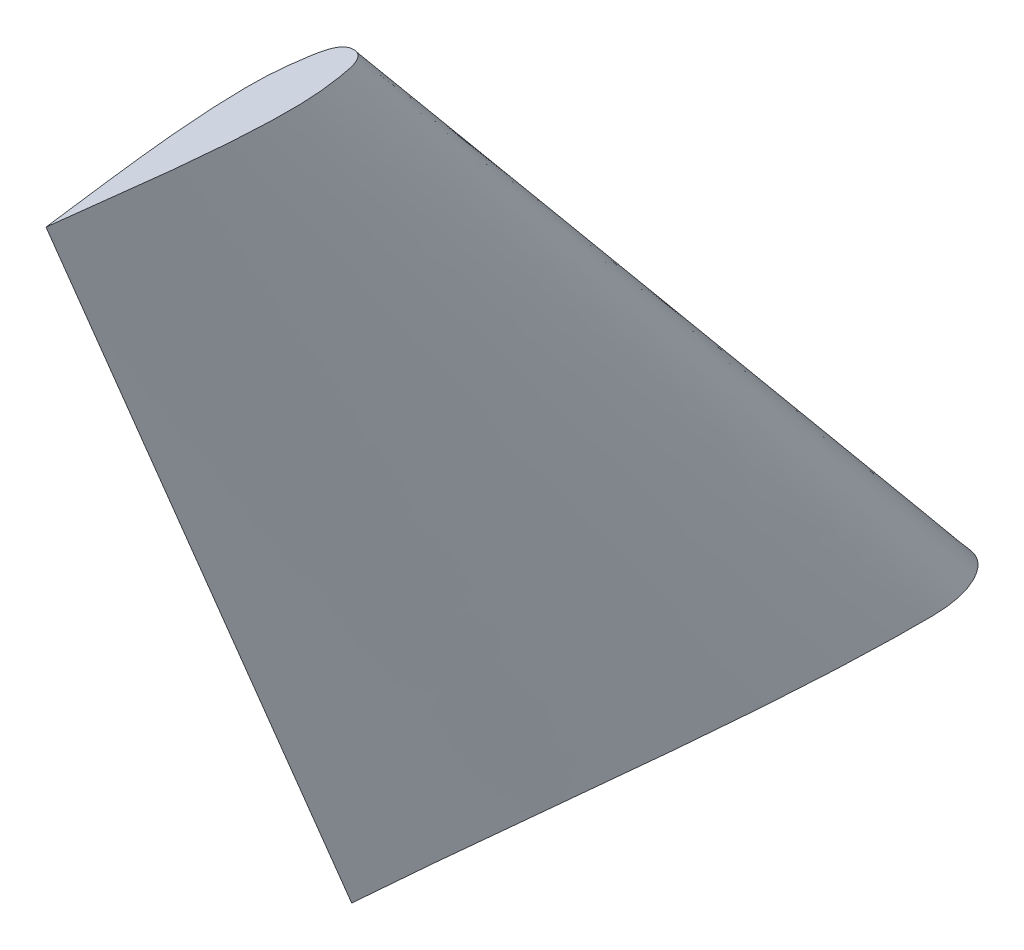
ISO-10303-21;
HEADER;
FILE_DESCRIPTION(('STEP AP214'),'2;1');
FILE_NAME('part.step','',(''),(''),'','','');
FILE_SCHEMA(('AUTOMOTIVE_DESIGN { 1 0 10303 214 1 1 1 1 }'));
ENDSEC;
DATA;
#1=APPLICATION_CONTEXT('core data for automotive mechanical design processes');
#2=APPLICATION_PROTOCOL_DEFINITION('international standard','automotive_design',2000,#1);
#3=PRODUCT_CONTEXT('',#1,'mechanical');
#4=PRODUCT('Part','Part','',(#3));
#5=PRODUCT_RELATED_PRODUCT_CATEGORY('part','',(#4));
#6=PRODUCT_DEFINITION_FORMATION('','',#4);
#7=PRODUCT_DEFINITION_CONTEXT('part definition',#1,'design');
#8=PRODUCT_DEFINITION('design','',#6,#7);
#9=PRODUCT_DEFINITION_SHAPE('','',#8);
#10=(LENGTH_UNIT() NAMED_UNIT(*) SI_UNIT(.MILLI.,.METRE.));
#11=(NAMED_UNIT(*) PLANE_ANGLE_UNIT() SI_UNIT($,.RADIAN.));
#12=(NAMED_UNIT(*) SI_UNIT($,.STERADIAN.) SOLID_ANGLE_UNIT());
#13=UNCERTAINTY_MEASURE_WITH_UNIT(LENGTH_MEASURE(1.E-05),#10,'distance_accuracy_value','');
#14=(GEOMETRIC_REPRESENTATION_CONTEXT(3) GLOBAL_UNCERTAINTY_ASSIGNED_CONTEXT((#13)) GLOBAL_UNIT_ASSIGNED_CONTEXT((#10,
#11,#12)) REPRESENTATION_CONTEXT('',''));
#15=CARTESIAN_POINT('',(0.,0.,0.));
#16=DIRECTION('',(0.,0.,1.));
#17=DIRECTION('',(1.,0.,0.));
#18=AXIS2_PLACEMENT_3D('',#15,#16,#17);
#19=CARTESIAN_POINT('',(186.355683918216,7657.2618,7922.07926030752));
#20=DIRECTION('',(0.,1.,0.));
#21=DIRECTION('',(0.,0.,1.));
#22=AXIS2_PLACEMENT_3D('',#19,#20,#21);
#23=PLANE('',#22);
#24=CARTESIAN_POINT('',(8.21499502243191E-13,7657.2618,9551.47559577085));
#25=CARTESIAN_POINT('',(85.8536731267102,7657.2618,8845.10345360032));
#26=CARTESIAN_POINT('',(250.417111798389,7657.2618,7729.63399537587));
#27=CARTESIAN_POINT('',(203.557677715276,7657.2618,6792.00969236417));
#28=CARTESIAN_POINT('',(114.976251497957,7657.2618,6360.95619577086));
#29=CARTESIAN_POINT('',(4.64905891561784E-13,7657.2618,6360.95619577086));
#30=B_SPLINE_CURVE_WITH_KNOTS('',3,(#24,#25,#26,#27,#28,#29),.UNSPECIFIED.,.F.,.F.,(4,1,1,4),
(0.,0.714088704934822,0.896349483933911,1.),.UNSPECIFIED.);
#31=CARTESIAN_POINT('',(8.66380139375366E-13,7657.2618,9551.47559577085));
#32=VERTEX_POINT('',#31);
#33=CARTESIAN_POINT('',(-3.58841129944124E-05,7657.2618,6360.95619577086));
#34=VERTEX_POINT('',#33);
#35=EDGE_CURVE('E102',#32,#34,#30,.T.);
#36=ORIENTED_EDGE('',*,*,#35,.T.);
#37=CARTESIAN_POINT('',(4.64905891561784E-13,7657.2618,6360.95619577086));
#38=CARTESIAN_POINT('',(-114.976251497956,7657.2618,6360.95619577086));
#39=CARTESIAN_POINT('',(-203.557677715276,7657.2618,6792.00969236417));
#40=CARTESIAN_POINT('',(-250.417111798388,7657.2618,7729.63399537587));
#41=CARTESIAN_POINT('',(-85.8536731267114,7657.2618,8845.10345360032));
#42=CARTESIAN_POINT('',(8.66380139375366E-13,7657.2618,9551.47559577085));
#43=B_SPLINE_CURVE_WITH_KNOTS('',3,(#37,#38,#39,#40,#41,#42),.UNSPECIFIED.,.F.,.F.,(4,1,1,4),
(0.,0.103650516066089,0.285911295065178,1.),.UNSPECIFIED.);
#44=EDGE_CURVE('E13',#34,#32,#43,.T.);
#45=ORIENTED_EDGE('',*,*,#44,.T.);
#46=EDGE_LOOP('',(#36,#45));
#47=FACE_BOUND('',#46,.T.);
#48=ADVANCED_FACE('F92',(#47),#23,.T.);
#49=CARTESIAN_POINT('',(317.422584093436,0.,3106.09999562608));
#50=DIRECTION('',(0.,1.,0.));
#51=DIRECTION('',(0.,0.,1.));
#52=AXIS2_PLACEMENT_3D('',#49,#50,#51);
#53=PLANE('',#52);
#54=CARTESIAN_POINT('',(7.62110748672077E-13,0.,6381.0388));
#55=CARTESIAN_POINT('',(135.516632530771,0.,4591.26948341147));
#56=CARTESIAN_POINT('',(459.330315844269,0.,2503.69122279822));
#57=CARTESIAN_POINT('',(429.111316456623,0.,403.655670705673));
#58=CARTESIAN_POINT('',(203.389315301826,0.,0.));
#59=CARTESIAN_POINT('',(0.,0.,0.));
#60=B_SPLINE_CURVE_WITH_KNOTS('',3,(#54,#55,#56,#57,#58,#59),.UNSPECIFIED.,.F.,.F.,(4,1,1,4),
(0.,0.841181970262739,0.912840830479199,1.),.UNSPECIFIED.);
#61=CARTESIAN_POINT('',(7.85501595113804E-13,0.,6381.0388));
#62=VERTEX_POINT('',#61);
#63=CARTESIAN_POINT('',(-0.000214897624335221,0.,0.));
#64=VERTEX_POINT('',#63);
#65=EDGE_CURVE('E127',#62,#64,#60,.T.);
#66=ORIENTED_EDGE('',*,*,#65,.F.);
#67=CARTESIAN_POINT('',(0.,0.,0.));
#68=CARTESIAN_POINT('',(-203.389315301826,0.,0.));
#69=CARTESIAN_POINT('',(-429.111316456623,0.,403.655670705672));
#70=CARTESIAN_POINT('',(-459.330315844269,0.,2503.69122279822));
#71=CARTESIAN_POINT('',(-135.516632530771,0.,4591.26948341147));
#72=CARTESIAN_POINT('',(7.85501595113804E-13,0.,6381.0388));
#73=B_SPLINE_CURVE_WITH_KNOTS('',3,(#67,#68,#69,#70,#71,#72),.UNSPECIFIED.,.F.,.F.,(4,1,1,4),
(0.,0.0871591695208015,0.158818029737261,1.),.UNSPECIFIED.);
#74=EDGE_CURVE('E124',#64,#62,#73,.T.);
#75=ORIENTED_EDGE('',*,*,#74,.F.);
#76=EDGE_LOOP('',(#66,#75));
#77=FACE_BOUND('',#76,.T.);
#78=ADVANCED_FACE('F126',(#77),#53,.F.);
#79=CARTESIAN_POINT('',(-0.000214897624335221,0.,0.));
#80=CARTESIAN_POINT('',(-0.000155226453887707,2552.4206,2120.31873192362));
#81=CARTESIAN_POINT('',(-9.55552834401921E-05,5104.8412,4240.63746384724));
#82=CARTESIAN_POINT('',(-3.58841129944124E-05,7657.2618,6360.95619577086));
#83=CARTESIAN_POINT('',(-8.58641909058416,0.,0.));
#84=CARTESIAN_POINT('',(-7.14742816589363,2552.4206,2120.31873192362));
#85=CARTESIAN_POINT('',(-5.70843724120311,5104.8412,4240.63746384724));
#86=CARTESIAN_POINT('',(-4.26944631651258,7657.2618,6360.95619577086));
#87=CARTESIAN_POINT('',(-25.759896161834,0.,0.791391700747513));
#88=CARTESIAN_POINT('',(-21.4431122576395,2552.4206,2120.99021937591));
#89=CARTESIAN_POINT('',(-17.1263283534451,5104.84120000001,4241.18904705106));
#90=CARTESIAN_POINT('',(-12.8095444492506,7657.26180000001,6361.38787472622));
#91=CARTESIAN_POINT('',(-51.2903069620717,0.,4.44356282761769));
#92=CARTESIAN_POINT('',(-42.6836120542045,2552.42059999999,2124.1186358765));
#93=CARTESIAN_POINT('',(-34.0769171463372,5104.84119999999,4243.79370892537));
#94=CARTESIAN_POINT('',(-25.47022223847,7657.26179999998,6363.46878197425));
#95=CARTESIAN_POINT('',(-76.3419763492192,0.,10.5664579766032));
#96=CARTESIAN_POINT('',(-63.49116447895,2552.42060000001,2129.39851794402));
#97=CARTESIAN_POINT('',(-50.6403526086807,5104.84120000002,4248.23057791143));
#98=CARTESIAN_POINT('',(-37.7895407384114,7657.26180000002,6367.06263787885));
#99=CARTESIAN_POINT('',(-100.686966910344,0.,19.0781807852257));
#100=CARTESIAN_POINT('',(-83.6469629783597,2552.42059999999,2136.77237279649));
#101=CARTESIAN_POINT('',(-66.6069590463759,5104.84119999999,4254.46656480776));
#102=CARTESIAN_POINT('',(-49.566955114392,7657.26179999998,6372.16075681902));
#103=CARTESIAN_POINT('',(-124.126516485176,0.,29.818862451615));
#104=CARTESIAN_POINT('',(-102.961622782143,2552.42060000001,2146.09814126592));
#105=CARTESIAN_POINT('',(-81.796729079111,5104.84120000001,4262.37742008022));
#106=CARTESIAN_POINT('',(-60.6318353760786,7657.26180000002,6378.65669889453));
#107=CARTESIAN_POINT('',(-146.534589998104,0.,42.5794578087664));
#108=CARTESIAN_POINT('',(-121.315486684902,2552.4206,2157.17861408429));
#109=CARTESIAN_POINT('',(-96.0963833716992,5104.8412,4271.77777035981));
#110=CARTESIAN_POINT('',(-70.8772800584966,7657.26179999999,6386.37692663533));
#111=CARTESIAN_POINT('',(-167.813486414974,0.,57.1220922538986));
#112=CARTESIAN_POINT('',(-138.630325895816,2552.4206,2169.78518123356));
#113=CARTESIAN_POINT('',(-109.447165376658,5104.8412,4282.44827021323));
#114=CARTESIAN_POINT('',(-80.2640048575004,7657.2618,6395.1113591929));
#115=CARTESIAN_POINT('',(-194.665676287825,0.,78.5829167872505));
#116=CARTESIAN_POINT('',(-160.331308129858,2552.4206,2188.34010838197));
#117=CARTESIAN_POINT('',(-125.996939971891,5104.84119999999,4298.09729997669));
#118=CARTESIAN_POINT('',(-91.6625718139239,7657.26179999999,6407.85449157141));
#119=CARTESIAN_POINT('',(-225.355086307879,0.,108.718769508397));
#120=CARTESIAN_POINT('',(-184.884042323736,2552.4206,2214.27167623462));
#121=CARTESIAN_POINT('',(-144.412998339592,5104.8412,4319.82458296084));
#122=CARTESIAN_POINT('',(-103.941954355449,7657.26180000001,6425.37748968706));
#123=CARTESIAN_POINT('',(-257.930018105795,0.,148.714825694696));
#124=CARTESIAN_POINT('',(-210.658258304091,2552.4206,2248.46051952688));
#125=CARTESIAN_POINT('',(-163.386498502387,5104.8412,4348.20621335907));
#126=CARTESIAN_POINT('',(-116.114738700683,7657.2618,6447.95190719126));
#127=CARTESIAN_POINT('',(-286.712692746919,0.,191.496131022113));
#128=CARTESIAN_POINT('',(-233.235761425267,2552.4206,2284.82558335717));
#129=CARTESIAN_POINT('',(-179.758830103614,5104.84119999999,4378.15503569223));
#130=CARTESIAN_POINT('',(-126.281898781962,7657.26179999999,6471.48448802729));
#131=CARTESIAN_POINT('',(-312.150800154988,0.,236.332366305832));
#132=CARTESIAN_POINT('',(-253.061163747773,2552.4206,2322.76330190216));
#133=CARTESIAN_POINT('',(-193.971527340559,5104.84120000001,4409.19423749849));
#134=CARTESIAN_POINT('',(-134.881890933344,7657.26180000001,6495.62517309482));
#135=CARTESIAN_POINT('',(-334.618677488732,0.,282.719322591736));
#136=CARTESIAN_POINT('',(-270.497150587094,2552.4206,2361.86783800602));
#137=CARTESIAN_POINT('',(-206.375623685457,5104.8412,4441.01635342031));
#138=CARTESIAN_POINT('',(-142.254096783819,7657.2618,6520.1648688346));
#139=CARTESIAN_POINT('',(-354.413895962148,0.,330.302917473413));
#140=CARTESIAN_POINT('',(-285.828877106481,2552.4206,2401.85921378709));
#141=CARTESIAN_POINT('',(-217.243858250814,5104.8412,4473.41551010076));
#142=CARTESIAN_POINT('',(-148.658839395146,7657.26180000001,6544.97180641443));
#143=CARTESIAN_POINT('',(-371.749124744476,0.,378.833386918108));
#144=CARTESIAN_POINT('',(-299.267459003855,2552.4206,2442.54266806825));
#145=CARTESIAN_POINT('',(-226.785793263235,5104.8412,4506.25194921838));
#146=CARTESIAN_POINT('',(-154.304127522615,7657.2618,6569.96123036852));
#147=CARTESIAN_POINT('',(-386.767369839134,0.,428.128526178291));
#148=CARTESIAN_POINT('',(-310.964194696892,2552.4206,2483.77763219685));
#149=CARTESIAN_POINT('',(-235.16101955465,5104.8412,4539.4267382154));
#150=CARTESIAN_POINT('',(-159.357844412408,7657.2618,6595.07584423396));
#151=CARTESIAN_POINT('',(-399.508807364748,0.,478.060200145017));
#152=CARTESIAN_POINT('',(-320.995759786967,2552.4206,2525.46508296834));
#153=CARTESIAN_POINT('',(-242.482712209185,5104.8412,4572.86996579167));
#154=CARTESIAN_POINT('',(-163.969664631404,7657.2618,6620.27484861499));
#155=CARTESIAN_POINT('',(-409.974965801421,0.,528.517290082204));
#156=CARTESIAN_POINT('',(-329.405138872338,2552.4206,2567.52123470583));
#157=CARTESIAN_POINT('',(-248.835311943255,5104.84119999999,4606.52517932946));
#158=CARTESIAN_POINT('',(-168.265485014173,7657.26179999999,6645.52912395309));
#159=CARTESIAN_POINT('',(-418.24759258402,0.,579.378417392363));
#160=CARTESIAN_POINT('',(-336.296292301743,2552.4206,2609.8560155022));
#161=CARTESIAN_POINT('',(-254.344992019465,5104.8412,4640.33361361203));
#162=CARTESIAN_POINT('',(-172.393691737188,7657.2618,6670.81121172186));
#163=CARTESIAN_POINT('',(-424.469464572837,0.,630.529095209966));
#164=CARTESIAN_POINT('',(-341.772327699914,2552.4206,2652.39152058623));
#165=CARTESIAN_POINT('',(-259.075190826991,5104.8412,4674.2539459625));
#166=CARTESIAN_POINT('',(-176.378053954067,7657.2618,6696.11637133877));
#167=CARTESIAN_POINT('',(-428.852102196026,0.,681.867721943306));
#168=CARTESIAN_POINT('',(-345.969538514267,2552.4206,2695.06046655977));
#169=CARTESIAN_POINT('',(-263.086974832508,5104.8412,4708.25321117624));
#170=CARTESIAN_POINT('',(-180.204411150749,7657.2618,6721.4459557927));
#171=CARTESIAN_POINT('',(-431.662147493104,0.,733.314165742358));
#172=CARTESIAN_POINT('',(-349.063652064271,2552.4206,2737.80936979569));
#173=CARTESIAN_POINT('',(-266.465156635437,5104.84119999999,4742.30457384902));
#174=CARTESIAN_POINT('',(-183.866661206604,7657.26179999999,6746.79977790234));
#175=CARTESIAN_POINT('',(-433.212846627461,0.,784.811852287034));
#176=CARTESIAN_POINT('',(-351.261465085308,2552.4206,2780.60045168682));
#177=CARTESIAN_POINT('',(-269.310083543154,5104.8412,4776.3890510866));
#178=CARTESIAN_POINT('',(-187.358702001001,7657.2618,6772.17765048638));
#179=CARTESIAN_POINT('',(-433.850156479728,0.,836.327364779922));
#180=CARTESIAN_POINT('',(-352.791284234513,2552.4206,2823.41132891647));
#181=CARTESIAN_POINT('',(-271.732411989299,5104.84120000001,4810.49529305302));
#182=CARTESIAN_POINT('',(-190.673539744084,7657.26180000001,6797.57925718956));
#183=CARTESIAN_POINT('',(-433.939042056308,0.,887.845696459307));
#184=CARTESIAN_POINT('',(-353.89408825287,2552.4206,2866.23189152508));
#185=CARTESIAN_POINT('',(-273.849134449433,5104.8412,4844.61808659086));
#186=CARTESIAN_POINT('',(-193.804180645996,7657.2618,6823.00428165664));
#187=CARTESIAN_POINT('',(-433.857539948716,0.,939.363797322214));
#188=CARTESIAN_POINT('',(-354.81996680699,2552.4206,2909.05985411013));
#189=CARTESIAN_POINT('',(-275.782393665263,5104.84119999999,4878.75591089805));
#190=CARTESIAN_POINT('',(-196.744820523537,7657.26179999999,6848.45196768597));
#191=CARTESIAN_POINT('',(-433.613648288481,0.,990.881448362189));
#192=CARTESIAN_POINT('',(-355.572317256822,2552.4206,2951.8948186001));
#193=CARTESIAN_POINT('',(-277.530986225163,5104.8412,4912.90818883802));
#194=CARTESIAN_POINT('',(-199.489655193504,7657.2618,6873.92155907593));
#195=CARTESIAN_POINT('',(-433.208729007278,0.,1042.39803545094));
#196=CARTESIAN_POINT('',(-356.150523328982,2552.4206,2994.73600232577));
#197=CARTESIAN_POINT('',(-279.092317650687,5104.8412,4947.0739692006));
#198=CARTESIAN_POINT('',(-202.034111972391,7657.26180000001,6899.41193607543));
#199=CARTESIAN_POINT('',(-432.646857062219,0.,1093.91315173615));
#200=CARTESIAN_POINT('',(-356.555777433709,2552.4206,3037.58276080189));
#201=CARTESIAN_POINT('',(-280.464697805199,5104.8412,4981.25236986763));
#202=CARTESIAN_POINT('',(-204.373618176689,7657.2618,6924.92197893337));
#203=CARTESIAN_POINT('',(-431.930695070181,0.,1145.42633110234));
#204=CARTESIAN_POINT('',(-356.789075201128,2552.4206,3080.43428075297));
#205=CARTESIAN_POINT('',(-281.647455332076,5104.8412,5015.44223040361));
#206=CARTESIAN_POINT('',(-206.505835463024,7657.2618,6950.45018005425));
#207=CARTESIAN_POINT('',(-431.06358963652,0.,1196.93718073217));
#208=CARTESIAN_POINT('',(-356.851868253687,2552.4206,3123.28979776896));
#209=CARTESIAN_POINT('',(-282.640146870855,5104.8412,5049.64241480575));
#210=CARTESIAN_POINT('',(-208.428425488022,7657.2618,6975.99503184254));
#211=CARTESIAN_POINT('',(-430.048462035651,0.,1248.44531022851));
#212=CARTESIAN_POINT('',(-356.746314540537,2552.4206,3166.148461263));
#213=CARTESIAN_POINT('',(-283.444167045423,5104.8412,5083.8516122975));
#214=CARTESIAN_POINT('',(-210.142019550308,7657.2618,7001.55476333199));
#215=CARTESIAN_POINT('',(-428.888403670412,0.,1299.9503665468));
#216=CARTESIAN_POINT('',(-356.474685429776,2552.4206,3209.00944554999));
#217=CARTESIAN_POINT('',(-284.060967189141,5104.8412,5118.06852455317));
#218=CARTESIAN_POINT('',(-211.647248948505,7657.2618,7027.12760355636));
#219=CARTESIAN_POINT('',(-427.586355140652,0.,1351.45201642407));
#220=CARTESIAN_POINT('',(-356.040273320712,2552.4206,3251.8719024175));
#221=CARTESIAN_POINT('',(-284.494191500771,5104.84120000001,5152.29178841094));
#222=CARTESIAN_POINT('',(-212.948109680831,7657.26180000001,7052.71167440437));
#223=CARTESIAN_POINT('',(-426.145285348602,0.,1402.94994956525));
#224=CARTESIAN_POINT('',(-355.446389480902,2552.4206,3294.73499896509));
#225=CARTESIAN_POINT('',(-284.747493613203,5104.84120000001,5186.52004836493));
#226=CARTESIAN_POINT('',(-214.048597745503,7657.26180000001,7078.30509776477));
#227=CARTESIAN_POINT('',(-424.042352582233,0.,1471.60852901836));
#228=CARTESIAN_POINT('',(-354.448060381216,2552.4206,3351.88561089343));
#229=CARTESIAN_POINT('',(-284.8537681802,5104.84120000001,5232.16269276851));
#230=CARTESIAN_POINT('',(-215.259475979183,7657.26180000001,7112.43977464358));
#231=CARTESIAN_POINT('',(-421.080586730666,0.,1557.42107798737));
#232=CARTESIAN_POINT('',(-352.824510651564,2552.42059999999,3423.32160564312));
#233=CARTESIAN_POINT('',(-284.568434572462,5104.84119999999,5289.22213329887));
#234=CARTESIAN_POINT('',(-216.31235849336,7657.26179999998,7155.12266095462));
#235=CARTESIAN_POINT('',(-417.016092181368,0.,1660.37718848034));
#236=CARTESIAN_POINT('',(-350.319262328439,2552.4206,3509.03602487807));
#237=CARTESIAN_POINT('',(-283.62243247551,5104.84120000001,5357.69486127581));
#238=CARTESIAN_POINT('',(-216.925602622581,7657.26180000001,7206.35369767354));
#239=CARTESIAN_POINT('',(-412.463278073508,0.,1763.31280061194));
#240=CARTESIAN_POINT('',(-347.311286333832,2552.4206,3594.73788535115));
#241=CARTESIAN_POINT('',(-282.159294594156,5104.8412,5426.16297009037));
#242=CARTESIAN_POINT('',(-217.007302854479,7657.26179999999,7257.58805482959));
#243=CARTESIAN_POINT('',(-407.443701262236,0.,1866.22665039092));
#244=CARTESIAN_POINT('',(-343.84814297821,2552.4206,3680.424819645));
#245=CARTESIAN_POINT('',(-280.252584694185,5104.8412,5494.62298889908));
#246=CARTESIAN_POINT('',(-216.657026410159,7657.2618,7308.82115815317));
#247=CARTESIAN_POINT('',(-401.978441420699,0.,1969.11774190754));
#248=CARTESIAN_POINT('',(-339.948990598054,2552.4206,3766.09507699395));
#249=CARTESIAN_POINT('',(-277.919539775409,5104.84119999999,5563.07241208036));
#250=CARTESIAN_POINT('',(-215.890088952764,7657.26179999999,7360.04974716676));
#251=CARTESIAN_POINT('',(-396.088123577593,0.,2071.98532652268));
#252=CARTESIAN_POINT('',(-335.638162131061,2552.4206,3851.74723184566));
#253=CARTESIAN_POINT('',(-275.188200684528,5104.84120000001,5631.50913716864));
#254=CARTESIAN_POINT('',(-214.738239237995,7657.26180000001,7411.27104249162));
#255=CARTESIAN_POINT('',(-389.79294505351,0.,2174.8288833886));
#256=CARTESIAN_POINT('',(-330.93592078071,2552.4206,3937.38020563405));
#257=CARTESIAN_POINT('',(-272.07889650791,5104.84119999999,5699.93152787951));
#258=CARTESIAN_POINT('',(-213.22187223511,7657.26179999999,7462.48285012496));
#259=CARTESIAN_POINT('',(-383.112689872653,0.,2277.64810683832));
#260=CARTESIAN_POINT('',(-325.863261728675,2552.4206,4022.99319652744));
#261=CARTESIAN_POINT('',(-268.613833584697,5104.8412,5768.33828621657));
#262=CARTESIAN_POINT('',(-211.36440544072,7657.2618,7513.68337590568));
#263=CARTESIAN_POINT('',(-376.066770171844,0.,2380.44287868014));
#264=CARTESIAN_POINT('',(-320.439517784438,2552.4206,4108.58565204653));
#265=CARTESIAN_POINT('',(-264.812265397032,5104.8412,5836.72842541293));
#266=CARTESIAN_POINT('',(-209.185013009626,7657.2618,7564.87119877933));
#267=CARTESIAN_POINT('',(-368.674208110804,0.,2483.21327637803));
#268=CARTESIAN_POINT('',(-314.683704596806,2552.4206,4194.15725380347));
#269=CARTESIAN_POINT('',(-260.693201082808,5104.8412,5905.10123122892));
#270=CARTESIAN_POINT('',(-206.70269756881,7657.2618,7616.04520865437));
#271=CARTESIAN_POINT('',(-360.953739717611,0.,2585.95951809336));
#272=CARTESIAN_POINT('',(-308.61402235307,2552.4206,4279.70785443917));
#273=CARTESIAN_POINT('',(-256.27430498853,5104.8412,5973.45619078497));
#274=CARTESIAN_POINT('',(-203.93458762399,7657.2618,7667.20452713078));
#275=CARTESIAN_POINT('',(-350.246997846213,0.,2722.92285862346));
#276=CARTESIAN_POINT('',(-300.126008962632,2552.4206,4393.74742350489));
#277=CARTESIAN_POINT('',(-250.005020079051,5104.8412,6064.57198838632));
#278=CARTESIAN_POINT('',(-199.88403119547,7657.2618,7735.39655326775));
#279=CARTESIAN_POINT('',(-336.13505631491,0.,2894.06890719331));
#280=CARTESIAN_POINT('',(-288.81823452679,2552.4206,4536.2449589447));
#281=CARTESIAN_POINT('',(-241.501412738669,5104.8412,6178.42101069608));
#282=CARTESIAN_POINT('',(-194.184590950548,7657.2618,7820.59706244746));
#283=CARTESIAN_POINT('',(-318.176566162172,0.,3099.35694168511));
#284=CARTESIAN_POINT('',(-274.263227398095,2552.4206,4707.16215898682));
#285=CARTESIAN_POINT('',(-230.349888634017,5104.8412,6314.96737628853));
#286=CARTESIAN_POINT('',(-186.43654986994,7657.2618,7922.77259359023));
#287=CARTESIAN_POINT('',(-299.331537617137,0.,3304.56534933049));
#288=CARTESIAN_POINT('',(-258.846508315067,2552.4206,4878.00460757822));
#289=CARTESIAN_POINT('',(-218.361479012996,5104.8412,6451.44386582596));
#290=CARTESIAN_POINT('',(-177.876449710926,7657.26180000001,8024.88312407369));
#291=CARTESIAN_POINT('',(-279.734520371428,0.,3509.70320378876));
#292=CARTESIAN_POINT('',(-242.686740349776,2552.4206,5048.77883801123));
#293=CARTESIAN_POINT('',(-205.638960328124,5104.8412,6587.8544722337));
#294=CARTESIAN_POINT('',(-168.591180306473,7657.26179999999,8126.93010645617));
#295=CARTESIAN_POINT('',(-259.517568752942,0.,3714.78083187621));
#296=CARTESIAN_POINT('',(-225.898224124428,2552.4206,5219.49257864675));
#297=CARTESIAN_POINT('',(-192.278879495915,5104.84120000001,6724.20432541728));
#298=CARTESIAN_POINT('',(-158.659534867402,7657.26180000001,8228.91607218782));
#299=CARTESIAN_POINT('',(-238.810901829392,0.,3919.80957326912));
#300=CARTESIAN_POINT('',(-208.591904980949,2552.42059999999,5390.15450918104));
#301=CARTESIAN_POINT('',(-178.372908132506,5104.84119999999,6860.49944509295));
#302=CARTESIAN_POINT('',(-148.153911284062,7657.26179999998,8330.84438100487));
#303=CARTESIAN_POINT('',(-217.743495697605,0.,4124.80158750387));
#304=CARTESIAN_POINT('',(-190.876193868182,2552.42060000001,5560.77408196353));
#305=CARTESIAN_POINT('',(-164.008892038758,5104.84120000001,6996.74657642318));
#306=CARTESIAN_POINT('',(-137.141590209334,7657.26180000002,8432.71907088284));
#307=CARTESIAN_POINT('',(-196.443741384427,0.,4329.76964948671));
#308=CARTESIAN_POINT('',(-172.857808839377,2552.42059999999,5731.36134746478));
#309=CARTESIAN_POINT('',(-149.271876294328,5104.84119999999,7132.95304544285));
#310=CARTESIAN_POINT('',(-125.685943749278,7657.26179999998,8534.54474342092));
#311=CARTESIAN_POINT('',(-175.039999692821,0.,4534.72699224611));
#312=CARTESIAN_POINT('',(-154.642489665981,2552.4206,5901.92682887798));
#313=CARTESIAN_POINT('',(-134.244979639142,5104.8412,7269.12666550986));
#314=CARTESIAN_POINT('',(-113.847469612303,7657.26180000001,8636.32650214173));
#315=CARTESIAN_POINT('',(-153.661390252062,0.,4739.6870843177));
#316=CARTESIAN_POINT('',(-136.335856516513,2552.4206,6072.48135982189));
#317=CARTESIAN_POINT('',(-119.010322780964,5104.84120000001,7405.27563532608));
#318=CARTESIAN_POINT('',(-101.684789045415,7657.26180000001,8738.06991083027));
#319=CARTESIAN_POINT('',(-132.438118504229,0.,4944.66354224438));
#320=CARTESIAN_POINT('',(-118.043947212185,2552.42059999999,6243.03602412536));
#321=CARTESIAN_POINT('',(-103.649775920141,5104.84119999999,7541.40850600635));
#322=CARTESIAN_POINT('',(-89.2556046280968,7657.26179999998,8839.78098788734));
#323=CARTESIAN_POINT('',(-111.502771653628,0.,5149.66977528132));
#324=CARTESIAN_POINT('',(-99.874403997197,2552.42060000001,6413.60192247245));
#325=CARTESIAN_POINT('',(-88.2460363407659,5104.84120000001,7677.53406966357));
#326=CARTESIAN_POINT('',(-76.6176686843348,7657.26180000002,8941.4662168547));
#327=CARTESIAN_POINT('',(-90.9899230909564,0.,5354.71908827888));
#328=CARTESIAN_POINT('',(-81.9365660203593,2552.42059999999,6584.19025310606));
#329=CARTESIAN_POINT('',(-72.8832089497621,5104.84119999999,7813.66141793325));
#330=CARTESIAN_POINT('',(-63.829851879165,7657.26179999998,9043.13258276043));
#331=CARTESIAN_POINT('',(-71.0387383342774,0.,5559.82395699641));
#332=CARTESIAN_POINT('',(-64.3435812865808,2552.4206,6754.81184433304));
#333=CARTESIAN_POINT('',(-57.6484242388841,5104.84120000001,7949.79973166967));
#334=CARTESIAN_POINT('',(-50.9532671911875,7657.26180000001,9144.7876190063));
#335=CARTESIAN_POINT('',(-51.7905276437564,0.,5764.99666596382));
#336=CARTESIAN_POINT('',(-47.2112568094636,2552.4206,6925.47760786523));
#337=CARTESIAN_POINT('',(-42.6319859751708,5104.8412,8085.95854976664));
#338=CARTESIAN_POINT('',(-38.052715140878,7657.2618,9246.43949166805));
#339=CARTESIAN_POINT('',(-33.3951918298595,0.,5970.2475038271));
#340=CARTESIAN_POINT('',(-30.6628707971704,2552.4206,7096.19736176111));
#341=CARTESIAN_POINT('',(-27.9305497644813,5104.8412,8222.14721969513));
#342=CARTESIAN_POINT('',(-25.1982287317921,7657.2618,9348.09707762914));
#343=CARTESIAN_POINT('',(-16.0028487963907,0.,6175.58696664189));
#344=CARTESIAN_POINT('',(-14.8243716615928,2552.4206,7266.981347698));
#345=CARTESIAN_POINT('',(-13.6458945267948,5104.8412,8358.3757287541));
#346=CARTESIAN_POINT('',(-12.4674173919969,7657.2618,9449.7701098102));
#347=CARTESIAN_POINT('',(-5.18628329098585,0.,6312.54351253603));
#348=CARTESIAN_POINT('',(-4.83118862879358,2552.4206,7380.88552294332));
#349=CARTESIAN_POINT('',(-4.47609396660131,5104.8412,8449.2275333506));
#350=CARTESIAN_POINT('',(-4.12099930440904,7657.2618,9517.56954375788));
#351=CARTESIAN_POINT('',(7.62110748672077E-13,0.,6381.0388));
#352=CARTESIAN_POINT('',(7.81906999862448E-13,2552.4206,7437.85106525695));
#353=CARTESIAN_POINT('',(8.01703251052819E-13,5104.8412,8494.6633305139));
#354=CARTESIAN_POINT('',(8.21499502243191E-13,7657.2618,9551.47559577085));
#355=B_SPLINE_SURFACE_WITH_KNOTS('',3,3,((#79,#80,#81,#82),(#83,#84,#85,#86),(#87,#88,#89,#90),
(#91,#92,#93,#94),(#95,#96,#97,#98),(#99,#100,#101,#102),(#103,#104,#105,#106),(#107,#108,#109,
#110),(#111,#112,#113,#114),(#115,#116,#117,#118),(#119,#120,#121,#122),(#123,#124,#125,#126),
(#127,#128,#129,#130),(#131,#132,#133,#134),(#135,#136,#137,#138),(#139,#140,#141,#142),(#143,
#144,#145,#146),(#147,#148,#149,#150),(#151,#152,#153,#154),(#155,#156,#157,#158),(#159,#160,
#161,#162),(#163,#164,#165,#166),(#167,#168,#169,#170),(#171,#172,#173,#174),(#175,#176,#177,
#178),(#179,#180,#181,#182),(#183,#184,#185,#186),(#187,#188,#189,#190),(#191,#192,#193,#194),
(#195,#196,#197,#198),(#199,#200,#201,#202),(#203,#204,#205,#206),(#207,#208,#209,#210),(#211,
#212,#213,#214),(#215,#216,#217,#218),(#219,#220,#221,#222),(#223,#224,#225,#226),(#227,#228,
#229,#230),(#231,#232,#233,#234),(#235,#236,#237,#238),(#239,#240,#241,#242),(#243,#244,#245,
#246),(#247,#248,#249,#250),(#251,#252,#253,#254),(#255,#256,#257,#258),(#259,#260,#261,#262),
(#263,#264,#265,#266),(#267,#268,#269,#270),(#271,#272,#273,#274),(#275,#276,#277,#278),(#279,
#280,#281,#282),(#283,#284,#285,#286),(#287,#288,#289,#290),(#291,#292,#293,#294),(#295,#296,
#297,#298),(#299,#300,#301,#302),(#303,#304,#305,#306),(#307,#308,#309,#310),(#311,#312,#313,
#314),(#315,#316,#317,#318),(#319,#320,#321,#322),(#323,#324,#325,#326),(#327,#328,#329,#330),
(#331,#332,#333,#334),(#335,#336,#337,#338),(#339,#340,#341,#342),(#343,#344,#345,#346),(#347,
#348,#349,#350),(#351,#352,#353,#354)),.UNSPECIFIED.,.F.,.F.,.F.,(4,1,1,1,1,1,1,1,1,1,1,1,1,1,1,
1,1,1,1,1,1,1,1,1,1,1,1,1,1,1,1,1,1,1,1,1,1,1,1,1,1,1,1,1,1,1,1,1,1,1,1,1,1,1,1,1,1,1,1,1,1,1,1,
1,1,1,4),(4,4),(0.500008358541819,0.501961450891265,0.503914543240711,0.505867635590157,
0.507820727939603,0.509773820289049,0.511726912638495,0.513680004987941,0.515633097337387,
0.519539282036279,0.523445466735171,0.527351651434063,0.531257836132955,0.535164020831847,
0.539070205530739,0.542976390229631,0.546882574928523,0.550788759627415,0.554694944326307,
0.5586011290252,0.562507313724091,0.566413498422984,0.570319683121876,0.574225867820768,
0.57813205251966,0.582038237218552,0.585944421917444,0.589850606616336,0.593756791315228,
0.59766297601412,0.601569160713012,0.605475345411904,0.609381530110796,0.613287714809688,
0.61719389950858,0.621100084207472,0.625006268906364,0.632818638304148,0.640631007701932,
0.648443377099716,0.656255746497501,0.664068115895285,0.671880485293069,0.679692854690853,
0.687505224088637,0.695317593486421,0.703129962884205,0.710942332281989,0.718754701679773,
0.734379440475341,0.75000417927091,0.765628918066478,0.781253656862046,0.796878395657614,
0.812503134453182,0.82812787324875,0.843752612044318,0.859377350839887,0.875002089635455,
0.890626828431023,0.906251567226591,0.921876306022159,0.937501044817727,0.953125783613296,
0.968750522408864,0.984375261204432,1.),(0.,1.),.UNSPECIFIED.);
#356=CARTESIAN_POINT('',(7.62110748672077E-13,0.,6381.0388));
#357=CARTESIAN_POINT('',(7.81906999862448E-13,2552.4206,7437.85106525695));
#358=CARTESIAN_POINT('',(8.01703251052819E-13,5104.8412,8494.6633305139));
#359=CARTESIAN_POINT('',(8.21499502243191E-13,7657.2618,9551.47559577085));
#360=B_SPLINE_CURVE_WITH_KNOTS('',3,(#356,#357,#358,#359),.UNSPECIFIED.,.F.,.F.,(4,4),(0.,1.),.UNSPECIFIED.);
#361=EDGE_CURVE('E137',#62,#32,#360,.T.);
#362=CARTESIAN_POINT('',(-0.000214897624335221,0.,0.));
#363=CARTESIAN_POINT('',(-0.000155226453887707,2552.4206,2120.31873192362));
#364=CARTESIAN_POINT('',(-9.55552834401921E-05,5104.8412,4240.63746384724));
#365=CARTESIAN_POINT('',(-3.58841129944124E-05,7657.2618,6360.95619577086));
#366=B_SPLINE_CURVE_WITH_KNOTS('',3,(#362,#363,#364,#365),.UNSPECIFIED.,.F.,.F.,(4,4),(0.,1.),.UNSPECIFIED.);
#367=EDGE_CURVE('E115',#64,#34,#366,.T.);
#368=ORIENTED_EDGE('',*,*,#74,.T.);
#369=ORIENTED_EDGE('',*,*,#361,.T.);
#370=ORIENTED_EDGE('',*,*,#44,.F.);
#371=ORIENTED_EDGE('',*,*,#367,.F.);
#372=EDGE_LOOP('',(#368,#369,#370,#371));
#373=FACE_BOUND('',#372,.T.);
#374=ADVANCED_FACE('F141',(#373),#355,.T.);
#375=CARTESIAN_POINT('',(7.62110748672077E-13,0.,6381.0388));
#376=CARTESIAN_POINT('',(7.81906999862448E-13,2552.4206,7437.85106525695));
#377=CARTESIAN_POINT('',(8.01703251052819E-13,5104.8412,8494.6633305139));
#378=CARTESIAN_POINT('',(8.21499502243191E-13,7657.2618,9551.47559577085));
#379=CARTESIAN_POINT('',(5.18619708796649,0.,6312.54465102006));
#380=CARTESIAN_POINT('',(4.8311539969318,2552.4206,7380.88609403981));
#381=CARTESIAN_POINT('',(4.47611090589711,5104.8412,8449.22753705957));
#382=CARTESIAN_POINT('',(4.12106781486242,7657.2618,9517.56898007932));
#383=CARTESIAN_POINT('',(16.0025919807156,0.,6175.59016791527));
#384=CARTESIAN_POINT('',(14.8242658134675,2552.4206,7266.98295357618));
#385=CARTESIAN_POINT('',(13.6459396462195,5104.8412,8358.37573923709));
#386=CARTESIAN_POINT('',(12.4676134789715,7657.2618,9449.768524898));
#387=CARTESIAN_POINT('',(33.3946982033783,0.,5970.25319689491));
#388=CARTESIAN_POINT('',(30.6626599398221,2552.42059999999,7096.20021743833));
#389=CARTESIAN_POINT('',(27.9306216762659,5104.84119999999,8222.14723798176));
#390=CARTESIAN_POINT('',(25.1985834127097,7657.26179999998,9348.09425852518));
#391=CARTESIAN_POINT('',(51.7898300426667,0.,5765.00428858291));
#392=CARTESIAN_POINT('',(47.2109513033592,2552.42060000001,6925.481430959));
#393=CARTESIAN_POINT('',(42.6320725640518,5104.84120000001,8085.9585733351));
#394=CARTESIAN_POINT('',(38.0531938247443,7657.26180000002,9246.43571571119));
#395=CARTESIAN_POINT('',(71.0378755285742,0.,5559.83298909259));
#396=CARTESIAN_POINT('',(64.3431954219088,2552.42059999999,6754.81637385748));
#397=CARTESIAN_POINT('',(57.6485153152435,5104.84119999999,7949.79975862237));
#398=CARTESIAN_POINT('',(50.9538352085781,7657.26179999998,9144.78314338726));
#399=CARTESIAN_POINT('',(90.9889398785234,0.,5354.72904969982));
#400=CARTESIAN_POINT('',(81.9361185242799,2552.4206,6584.19524803714));
#401=CARTESIAN_POINT('',(72.8832971700363,5104.84120000001,7813.66144637446));
#402=CARTESIAN_POINT('',(63.8304758157927,7657.26180000001,9043.12764471178));
#403=CARTESIAN_POINT('',(111.501714181885,0.,5149.68022695849));
#404=CARTESIAN_POINT('',(99.8739152335216,2552.4206,6413.6071625622));
#405=CARTESIAN_POINT('',(88.2461162851579,5104.84119999999,7677.53409816591));
#406=CARTESIAN_POINT('',(76.6183173367942,7657.26179999999,8941.46103376962));
#407=CARTESIAN_POINT('',(132.437033174818,0.,4944.67408518989));
#408=CARTESIAN_POINT('',(118.043438691247,2552.4206,6243.04130926709));
#409=CARTESIAN_POINT('',(103.649844207676,5104.8412,7541.40853334429));
#410=CARTESIAN_POINT('',(89.2562497241046,7657.26180000001,8839.77575742149));
#411=CARTESIAN_POINT('',(153.660321139773,0.,4739.69735989379));
#412=CARTESIAN_POINT('',(136.335349351693,2552.4206,6072.48651025241));
#413=CARTESIAN_POINT('',(119.010377563614,5104.8412,7405.27566061103));
#414=CARTESIAN_POINT('',(101.685405775535,7657.2618,8738.06481096965));
#415=CARTESIAN_POINT('',(175.038987352075,0.,4534.73668171815));
#416=CARTESIAN_POINT('',(154.642003908833,2552.42059999999,5901.93168489597));
#417=CARTESIAN_POINT('',(134.245020465592,5104.84119999999,7269.1266880738));
#418=CARTESIAN_POINT('',(113.84803702235,7657.26179999998,8636.32169125163));
#419=CARTESIAN_POINT('',(196.442821323007,0.,4329.77847403205));
#420=CARTESIAN_POINT('',(172.85736255566,2552.4206,5731.36576944599));
#421=CARTESIAN_POINT('',(149.271903788313,5104.8412,7132.95306485994));
#422=CARTESIAN_POINT('',(125.686445020967,7657.2618,8534.54036027388));
#423=CARTESIAN_POINT('',(217.742697467457,0.,4124.80930800603));
#424=CARTESIAN_POINT('',(190.875802595233,2552.4206,5560.7779502273));
#425=CARTESIAN_POINT('',(164.008907723009,5104.8412,6996.74659244858));
#426=CARTESIAN_POINT('',(137.142012850785,7657.2618,8432.71523466985));
#427=CARTESIAN_POINT('',(238.810248187165,0.,3919.81599027341));
#428=CARTESIAN_POINT('',(208.591581205745,2552.4206,5390.15772395919));
#429=CARTESIAN_POINT('',(178.372914224326,5104.84119999999,6860.49945764498));
#430=CARTESIAN_POINT('',(148.154247242907,7657.26179999999,8330.84119133077));
#431=CARTESIAN_POINT('',(259.517075140894,0.,3714.78578551466));
#432=CARTESIAN_POINT('',(225.897976952655,2552.4206,5219.49506002712));
#433=CARTESIAN_POINT('',(192.278878764416,5104.8412,6724.20433453958));
#434=CARTESIAN_POINT('',(158.659780576176,7657.26180000001,8228.91360905204));
#435=CARTESIAN_POINT('',(279.734194587797,0.,3509.70657377268));
#436=CARTESIAN_POINT('',(242.68657527995,2552.4206,5048.78052592114));
#437=CARTESIAN_POINT('',(205.638955972103,5104.84119999999,6587.85447806961));
#438=CARTESIAN_POINT('',(168.591336664256,7657.26179999999,8126.92843021808));
#439=CARTESIAN_POINT('',(299.331379728805,0.,3304.56705496124));
#440=CARTESIAN_POINT('',(258.846427152787,2552.4206,4878.00546177569));
#441=CARTESIAN_POINT('',(218.361474576768,5104.8412,6451.44386859013));
#442=CARTESIAN_POINT('',(177.87652200075,7657.26180000001,8024.88227540457));
#443=CARTESIAN_POINT('',(318.176568627714,0.,3099.3569419071));
#444=CARTESIAN_POINT('',(274.26322828966,2552.4206,4707.1621590744));
#445=CARTESIAN_POINT('',(230.349887951605,5104.8412,6314.96737624169));
#446=CARTESIAN_POINT('',(186.436547613551,7657.2618,7922.77259340899));
#447=CARTESIAN_POINT('',(336.135204345179,0.,2894.06720067552));
#448=CARTESIAN_POINT('',(288.818312124918,2552.4206,4536.24410439728));
#449=CARTESIAN_POINT('',(241.501419904657,5104.8412,6178.42100811904));
#450=CARTESIAN_POINT('',(194.184527684396,7657.2618,7820.59791184081));
#451=CARTESIAN_POINT('',(350.24724929745,0.,2722.91976190992));
#452=CARTESIAN_POINT('',(300.126143354258,2552.4206,4393.74587291938));
#453=CARTESIAN_POINT('',(250.005037411066,5104.84119999999,6064.57198392885));
#454=CARTESIAN_POINT('',(199.883931467875,7657.26179999999,7735.39809493831));
#455=CARTESIAN_POINT('',(360.954060268451,0.,2585.955348463));
#456=CARTESIAN_POINT('',(308.614196513066,2552.4206,4279.70576670169));
#457=CARTESIAN_POINT('',(256.27433275768,5104.8412,5973.45618494038));
#458=CARTESIAN_POINT('',(203.934469002294,7657.2618,7667.20660317906));
#459=CARTESIAN_POINT('',(368.674573063088,0.,2483.20832669458));
#460=CARTESIAN_POINT('',(314.683905466769,2552.4206,4194.15477554399));
#461=CARTESIAN_POINT('',(260.69323787045,5104.8412,5905.1012243934));
#462=CARTESIAN_POINT('',(206.702570274131,7657.26179999999,7616.04767324282));
#463=CARTESIAN_POINT('',(376.067171535298,0.,2380.43717859708));
#464=CARTESIAN_POINT('',(320.439741975579,2552.4206,4108.58279811113));
#465=CARTESIAN_POINT('',(264.81231241586,5104.8412,5836.72841762517));
#466=CARTESIAN_POINT('',(209.18488285614,7657.26180000001,7564.87403713922));
#467=CARTESIAN_POINT('',(383.113119199912,0.,2277.64169104207));
#468=CARTESIAN_POINT('',(325.863505652839,2552.4206,4022.98998427172));
#469=CARTESIAN_POINT('',(268.613892105767,5104.8412,5768.33827750137));
#470=CARTESIAN_POINT('',(211.364278558694,7657.2618,7513.68657073102));
#471=CARTESIAN_POINT('',(389.793393522477,0.,2174.82179160711));
#472=CARTESIAN_POINT('',(330.936180654819,2552.4206,3937.37665492521));
#473=CARTESIAN_POINT('',(272.07896778716,5104.84119999999,5699.93151824331));
#474=CARTESIAN_POINT('',(213.221754919502,7657.26179999999,7462.48638156141));
#475=CARTESIAN_POINT('',(396.088582102367,0.,2071.97760353698));
#476=CARTESIAN_POINT('',(335.638434098999,2552.4206,3851.74336506769));
#477=CARTESIAN_POINT('',(275.18828609563,5104.84120000001,5631.5091265984));
#478=CARTESIAN_POINT('',(214.738138092261,7657.26180000001,7411.2748881291));
#479=CARTESIAN_POINT('',(401.978900764986,0.,1969.10943756127));
#480=CARTESIAN_POINT('',(339.949270657499,2552.42059999999,3766.09091904753));
#481=CARTESIAN_POINT('',(277.919640550012,5104.84119999998,5563.07240053379));
#482=CARTESIAN_POINT('',(215.890010442525,7657.26179999997,7360.05388202005));
#483=CARTESIAN_POINT('',(407.444152164728,0.,1866.21781960043));
#484=CARTESIAN_POINT('',(343.848427276148,2552.42060000001,3680.42039795532));
#485=CARTESIAN_POINT('',(280.252702387567,5104.84120000002,5494.62297631021));
#486=CARTESIAN_POINT('',(216.656977498987,7657.26180000003,7308.8255546651));
#487=CARTESIAN_POINT('',(412.463711388016,0.,1763.30350337493));
#488=CARTESIAN_POINT('',(347.311570783309,2552.42059999999,3594.7332298601));
#489=CARTESIAN_POINT('',(282.159430178601,5104.84119999998,5426.16295634528));
#490=CARTESIAN_POINT('',(217.007289573893,7657.26179999997,7257.59268283045));
#491=CARTESIAN_POINT('',(417.01649902003,0.,1660.36748988375));
#492=CARTESIAN_POINT('',(350.319543503572,2552.42060000001,3509.031168064));
#493=CARTESIAN_POINT('',(283.622587987115,5104.84120000001,5357.69484624426));
#494=CARTESIAN_POINT('',(216.925632470658,7657.26180000002,7206.35852442451));
#495=CARTESIAN_POINT('',(421.080958637638,0.,1557.41104821359));
#496=CARTESIAN_POINT('',(352.82478834933,2552.42059999999,3423.31658244623));
#497=CARTESIAN_POINT('',(284.568618061022,5104.84119999999,5289.22211667888));
#498=CARTESIAN_POINT('',(216.312447772714,7657.26179999998,7155.12765091152));
#499=CARTESIAN_POINT('',(424.042688818587,0.,1471.59828599876));
#500=CARTESIAN_POINT('',(354.448334250216,2552.4206,3351.88048017994));
#501=CARTESIAN_POINT('',(284.853979681845,5104.84120000001,5232.16267436111));
#502=CARTESIAN_POINT('',(215.259625113474,7657.26180000001,7112.44486854229));
#503=CARTESIAN_POINT('',(426.145589528567,0.,1402.9395761411));
#504=CARTESIAN_POINT('',(355.446659582117,2552.4206,3294.72980214706));
#505=CARTESIAN_POINT('',(284.747729635668,5104.8412,5186.52002815301));
#506=CARTESIAN_POINT('',(214.048799689218,7657.2618,7078.31025415896));
#507=CARTESIAN_POINT('',(427.586633599463,0.,1351.44156593015));
#508=CARTESIAN_POINT('',(356.040540085808,2552.4206,3251.86666628938));
#509=CARTESIAN_POINT('',(284.494446572153,5104.84119999999,5152.29176664861));
#510=CARTESIAN_POINT('',(212.948353058499,7657.26179999999,7052.71686700784));
#511=CARTESIAN_POINT('',(428.888654966533,0.,1299.93986035448));
#512=CARTESIAN_POINT('',(356.47494829474,2552.4206,3209.00418069413));
#513=CARTESIAN_POINT('',(284.061241622948,5104.8412,5118.06850103378));
#514=CARTESIAN_POINT('',(211.647534951155,7657.2618,7027.13282137343));
#515=CARTESIAN_POINT('',(430.048684644867,0.,1248.43477034604));
#516=CARTESIAN_POINT('',(356.746572682727,2552.4206,3166.1431785855));
#517=CARTESIAN_POINT('',(283.444460720588,5104.8412,5083.85158682495));
#518=CARTESIAN_POINT('',(210.142348758449,7657.2618,7001.55999506441));
#519=CARTESIAN_POINT('',(431.063782633957,0.,1196.92662980537));
#520=CARTESIAN_POINT('',(356.852121046517,2552.4206,3123.28450850006));
#521=CARTESIAN_POINT('',(282.640459459078,5104.8412,5049.64238719475));
#522=CARTESIAN_POINT('',(208.428797871639,7657.2618,6976.00026588944));
#523=CARTESIAN_POINT('',(431.930856872428,0.,1145.41579241208));
#524=CARTESIAN_POINT('',(356.789321356269,2552.4206,3080.42899645669));
#525=CARTESIAN_POINT('',(281.64778584011,5104.8412,5015.4422005013));
#526=CARTESIAN_POINT('',(206.506250323951,7657.2618,6950.4554045459));
#527=CARTESIAN_POINT('',(432.646987832971,0.,1093.90264920141));
#528=CARTESIAN_POINT('',(356.556016604851,2552.4206,3037.57749337801));
#529=CARTESIAN_POINT('',(280.46504537673,5104.8412,4981.2523375546));
#530=CARTESIAN_POINT('',(204.37407414861,7657.2618,6924.9271817312));
#531=CARTESIAN_POINT('',(433.20882619913,0.,1042.38759362097));
#532=CARTESIAN_POINT('',(356.150753179597,2552.4206,2994.73076401096));
#533=CARTESIAN_POINT('',(279.092680160064,5104.8412,4947.07393440094));
#534=CARTESIAN_POINT('',(202.034607140531,7657.2618,6899.41710479093));
#535=CARTESIAN_POINT('',(433.613715047979,0.,990.871092428618));
#536=CARTESIAN_POINT('',(355.57253906353,2552.4206,2951.88962197597));
#537=CARTESIAN_POINT('',(277.53136307908,5104.8412,4912.90815152332));
#538=CARTESIAN_POINT('',(199.490187094631,7657.2618,6873.92668107067));
#539=CARTESIAN_POINT('',(433.857569206222,0.,939.353553092968));
#540=CARTESIAN_POINT('',(354.820174858081,2552.4206,2909.05471209387));
#541=CARTESIAN_POINT('',(275.782780509941,5104.84119999999,4878.75587109477));
#542=CARTESIAN_POINT('',(196.745386161801,7657.26179999999,6848.45703009567));
#543=CARTESIAN_POINT('',(433.939048560054,0.,887.835590408109));
#544=CARTESIAN_POINT('',(353.894291204347,2552.4206,2866.22681740246));
#545=CARTESIAN_POINT('',(273.849533848639,5104.8412,4844.61804439681));
#546=CARTESIAN_POINT('',(193.804776492931,7657.2618,6823.00927139116));
#547=CARTESIAN_POINT('',(433.850099652103,0.,836.317423925416));
#548=CARTESIAN_POINT('',(352.791453756841,2552.4206,2823.40633625563));
#549=CARTESIAN_POINT('',(271.732807861579,5104.8412,4810.49524858584));
#550=CARTESIAN_POINT('',(190.674161966318,7657.2618,6797.58416091606));
#551=CARTESIAN_POINT('',(433.21264876943,0.,784.802105698342));
#552=CARTESIAN_POINT('',(351.261547999705,2552.4206,2780.59555534198));
#553=CARTESIAN_POINT('',(269.310447229979,5104.8412,4776.38900498562));
#554=CARTESIAN_POINT('',(187.359346460254,7657.2618,6772.18245462925));
#555=CARTESIAN_POINT('',(431.66175305379,0.,733.304645926546));
#556=CARTESIAN_POINT('',(349.063609800441,2552.4206,2737.804586845));
#557=CARTESIAN_POINT('',(266.465466547093,5104.84119999999,4742.30452776345));
#558=CARTESIAN_POINT('',(183.867323293745,7657.26179999999,6746.80446868191));
#559=CARTESIAN_POINT('',(428.851460425655,0.,681.858465500575));
#560=CARTESIAN_POINT('',(345.969335545702,2552.4206,2695.05581674211));
#561=CARTESIAN_POINT('',(263.087210665748,5104.8412,4708.25316798365));
#562=CARTESIAN_POINT('',(180.205085785794,7657.2618,6721.45051922518));
#563=CARTESIAN_POINT('',(424.468542111641,0.,630.520142842972));
#564=CARTESIAN_POINT('',(341.771940181881,2552.4206,2652.38702626754));
#565=CARTESIAN_POINT('',(259.075338252121,5104.84120000001,4674.2539096921));
#566=CARTESIAN_POINT('',(176.378736322361,7657.26180000001,6696.12079311667));
#567=CARTESIAN_POINT('',(418.246370974381,0.,579.369812936971));
#568=CARTESIAN_POINT('',(336.295706412722,2552.4206,2609.8517010293));
#569=CARTESIAN_POINT('',(254.345041851063,5104.84119999999,4640.33358912163));
#570=CARTESIAN_POINT('',(172.394377289404,7657.26179999999,6670.81547721396));
#571=CARTESIAN_POINT('',(409.97344551727,0.,528.509078836255));
#572=CARTESIAN_POINT('',(329.404351873464,2552.4206,2567.51712556655));
#573=CARTESIAN_POINT('',(248.835258229659,5104.8412,4606.52517229684));
#574=CARTESIAN_POINT('',(168.266164585853,7657.2618,6645.53321902713));
#575=CARTESIAN_POINT('',(399.507006074214,0.,478.052426747051));
#576=CARTESIAN_POINT('',(320.994787857552,2552.4206,2525.46120286245));
#577=CARTESIAN_POINT('',(242.48256964089,5104.8412,4572.86997897784));
#578=CARTESIAN_POINT('',(163.970351424228,7657.2618,6620.27875509324));
#579=CARTESIAN_POINT('',(386.765322819176,0.,428.121232267979));
#580=CARTESIAN_POINT('',(310.963066139768,2552.4206,2483.77400245811));
#581=CARTESIAN_POINT('',(235.160809460359,5104.84119999999,4539.42677264824));
#582=CARTESIAN_POINT('',(159.358552780951,7657.26179999999,6595.07954283838));
#583=CARTESIAN_POINT('',(371.746879488808,0.,378.826609635435));
#584=CARTESIAN_POINT('',(299.266208540262,2552.42060000001,2442.53930696344));
#585=CARTESIAN_POINT('',(226.785537591715,5104.84120000001,4506.25200429145));
#586=CARTESIAN_POINT('',(154.304866643169,7657.26180000002,6569.96470161945));
#587=CARTESIAN_POINT('',(354.411489233461,0.,330.296696412656));
#588=CARTESIAN_POINT('',(285.827532008604,2552.4206,2401.85614082779));
#589=CARTESIAN_POINT('',(217.243574783747,5104.84119999999,4473.41558524292));
#590=CARTESIAN_POINT('',(148.659617558891,7657.26179999999,6544.97502965805));
#591=CARTESIAN_POINT('',(334.616145267211,0.,282.713698930897));
#592=CARTESIAN_POINT('',(270.49573671734,2552.4206,2361.86507335488));
#593=CARTESIAN_POINT('',(206.375328167469,5104.8412,4441.01644777886));
#594=CARTESIAN_POINT('',(142.254919617598,7657.2618,6520.16782220285));
#595=CARTESIAN_POINT('',(312.148179673527,0.,236.327382936312));
#596=CARTESIAN_POINT('',(253.059707158318,2552.4206,2322.76086625287));
#597=CARTESIAN_POINT('',(193.971234643109,5104.84119999999,4409.19434956942));
#598=CARTESIAN_POINT('',(134.8827621279,7657.26179999999,6495.62783288598));
#599=CARTESIAN_POINT('',(286.710027541632,0.,191.4918317696));
#600=CARTESIAN_POINT('',(233.234291310417,2552.4206,2284.82349726229));
#601=CARTESIAN_POINT('',(179.758555079202,5104.84120000001,4378.15516275499));
#602=CARTESIAN_POINT('',(126.282818847988,7657.26180000001,6471.48682824768));
#603=CARTESIAN_POINT('',(257.927362687258,0.,148.711253518636));
#604=CARTESIAN_POINT('',(210.656809567359,2552.4206,2248.4588019316));
#605=CARTESIAN_POINT('',(163.386256447461,5104.84119999999,4348.20635034457));
#606=CARTESIAN_POINT('',(116.115703327563,7657.26179999999,6447.95389875754));
#607=CARTESIAN_POINT('',(225.352514131382,0.,108.715961971227));
#608=CARTESIAN_POINT('',(184.882659456909,2552.4206,2214.2703414883));
#609=CARTESIAN_POINT('',(144.412804782437,5104.84120000001,4319.82472100537));
#610=CARTESIAN_POINT('',(103.942950107964,7657.26180000001,6425.37910052244));
#611=CARTESIAN_POINT('',(194.663258657585,0.,78.5807643582098));
#612=CARTESIAN_POINT('',(160.330028324497,2552.42059999999,2188.33909533564));
#613=CARTESIAN_POINT('',(125.99679799141,5104.84119999998,4298.09742631307));
#614=CARTESIAN_POINT('',(91.6635676583228,7657.26179999997,6407.85575729049));
#615=CARTESIAN_POINT('',(167.811263800391,0.,57.120455555398));
#616=CARTESIAN_POINT('',(138.629165264901,2552.42060000001,2169.78441630587));
#617=CARTESIAN_POINT('',(109.447066729411,5104.84120000001,4282.44837705634));
#618=CARTESIAN_POINT('',(80.2649681939208,7657.26180000002,6395.11233780682));
#619=CARTESIAN_POINT('',(146.532554309802,0.,42.5781941577089));
#620=CARTESIAN_POINT('',(121.314434946787,2552.4206,2157.17802592097));
#621=CARTESIAN_POINT('',(96.096315583773,5104.8412,4271.77785768423));
#622=CARTESIAN_POINT('',(70.8781962207587,7657.2618,6386.3776894475));
#623=CARTESIAN_POINT('',(124.124713362899,0.,29.817948525058));
#624=CARTESIAN_POINT('',(102.960700744932,2552.4206,2146.0977165419));
#625=CARTESIAN_POINT('',(81.7966881269647,5104.8412,4262.37748455874));
#626=CARTESIAN_POINT('',(60.6326755089976,7657.2618,6378.65725257559));
#627=CARTESIAN_POINT('',(100.68544394036,0.,19.0775789178279));
#628=CARTESIAN_POINT('',(83.646191032105,2552.4206,2136.77209238351));
#629=CARTESIAN_POINT('',(66.6069381238504,5104.8412,4254.46660584919));
#630=CARTESIAN_POINT('',(49.5676852155957,7657.2618,6372.16111931488));
#631=CARTESIAN_POINT('',(76.340780581994,0.,10.5661166946108));
#632=CARTESIAN_POINT('',(63.4905623258438,2552.4206,2129.39835779938));
#633=CARTESIAN_POINT('',(50.6403440696936,5104.8412,4248.23059890415));
#634=CARTESIAN_POINT('',(37.7901258135434,7657.2618,6367.06284000892));
#635=CARTESIAN_POINT('',(51.2894801877844,0.,4.44341667372578));
#636=CARTESIAN_POINT('',(42.6831973056791,2552.4206,2124.11856646259));
#637=CARTESIAN_POINT('',(34.0769144235738,5104.8412,4243.79371625145));
#638=CARTESIAN_POINT('',(25.4706315414685,7657.2618,6363.46886604031));
#639=CARTESIAN_POINT('',(25.7594712275788,0.,0.791365330260238));
#640=CARTESIAN_POINT('',(21.4428994154177,2552.4206,2120.99020659179));
#641=CARTESIAN_POINT('',(17.1263276032567,5104.8412,4241.18904785332));
#642=CARTESIAN_POINT('',(12.8097557910957,7657.26179999999,6361.38788911485));
#643=CARTESIAN_POINT('',(8.58627637272137,0.,0.));
#644=CARTESIAN_POINT('',(7.14735668009932,2552.4206,2120.31873192362));
#645=CARTESIAN_POINT('',(5.70843698747728,5104.8412,4240.63746384724));
#646=CARTESIAN_POINT('',(4.26951729485523,7657.2618,6360.95619577086));
#647=CARTESIAN_POINT('',(-0.000214897624335221,0.,0.));
#648=CARTESIAN_POINT('',(-0.000155226453887707,2552.4206,2120.31873192362));
#649=CARTESIAN_POINT('',(-9.55552834401921E-05,5104.8412,4240.63746384724));
#650=CARTESIAN_POINT('',(-3.58841129944124E-05,7657.2618,6360.95619577086));
#651=B_SPLINE_SURFACE_WITH_KNOTS('',3,3,((#375,#376,#377,#378),(#379,#380,#381,#382),(#383,#384,
#385,#386),(#387,#388,#389,#390),(#391,#392,#393,#394),(#395,#396,#397,#398),(#399,#400,#401,
#402),(#403,#404,#405,#406),(#407,#408,#409,#410),(#411,#412,#413,#414),(#415,#416,#417,#418),
(#419,#420,#421,#422),(#423,#424,#425,#426),(#427,#428,#429,#430),(#431,#432,#433,#434),(#435,
#436,#437,#438),(#439,#440,#441,#442),(#443,#444,#445,#446),(#447,#448,#449,#450),(#451,#452,
#453,#454),(#455,#456,#457,#458),(#459,#460,#461,#462),(#463,#464,#465,#466),(#467,#468,#469,
#470),(#471,#472,#473,#474),(#475,#476,#477,#478),(#479,#480,#481,#482),(#483,#484,#485,#486),
(#487,#488,#489,#490),(#491,#492,#493,#494),(#495,#496,#497,#498),(#499,#500,#501,#502),(#503,
#504,#505,#506),(#507,#508,#509,#510),(#511,#512,#513,#514),(#515,#516,#517,#518),(#519,#520,
#521,#522),(#523,#524,#525,#526),(#527,#528,#529,#530),(#531,#532,#533,#534),(#535,#536,#537,
#538),(#539,#540,#541,#542),(#543,#544,#545,#546),(#547,#548,#549,#550),(#551,#552,#553,#554),
(#555,#556,#557,#558),(#559,#560,#561,#562),(#563,#564,#565,#566),(#567,#568,#569,#570),(#571,
#572,#573,#574),(#575,#576,#577,#578),(#579,#580,#581,#582),(#583,#584,#585,#586),(#587,#588,
#589,#590),(#591,#592,#593,#594),(#595,#596,#597,#598),(#599,#600,#601,#602),(#603,#604,#605,
#606),(#607,#608,#609,#610),(#611,#612,#613,#614),(#615,#616,#617,#618),(#619,#620,#621,#622),
(#623,#624,#625,#626),(#627,#628,#629,#630),(#631,#632,#633,#634),(#635,#636,#637,#638),(#639,
#640,#641,#642),(#643,#644,#645,#646),(#647,#648,#649,#650)),.UNSPECIFIED.,.F.,.F.,.F.,(4,1,1,1,
1,1,1,1,1,1,1,1,1,1,1,1,1,1,1,1,1,1,1,1,1,1,1,1,1,1,1,1,1,1,1,1,1,1,1,1,1,1,1,1,1,1,1,1,1,1,1,1,
1,1,1,1,1,1,1,1,1,1,1,1,1,1,4),(4,4),(0.,0.0156252612044318,0.0312505224088637,
0.0468757836132956,0.0625010448177274,0.0781263060221593,0.0937515672265911,0.109376828431023,
0.125002089635455,0.140627350839887,0.156252612044319,0.17187787324875,0.187503134453182,
0.203128395657614,0.218753656862046,0.234378918066478,0.25000417927091,0.265629440475341,
0.281254701679773,0.289067332281989,0.296879962884205,0.304692593486421,0.312505224088637,
0.320317854690853,0.328130485293069,0.335943115895285,0.343755746497501,0.351568377099716,
0.359381007701932,0.367193638304148,0.375006268906364,0.378912584207472,0.38281889950858,
0.386725214809688,0.390631530110796,0.394537845411904,0.398444160713012,0.40235047601412,
0.406256791315228,0.410163106616336,0.414069421917444,0.417975737218552,0.42188205251966,
0.425788367820768,0.429694683121876,0.433600998422984,0.437507313724092,0.4414136290252,
0.445319944326308,0.449226259627415,0.453132574928523,0.457038890229631,0.460945205530739,
0.464851520831847,0.468757836132955,0.472664151434063,0.476570466735171,0.480476782036279,
0.484383097337387,0.486336254987941,0.488289412638495,0.490242570289049,0.492195727939603,
0.494148885590157,0.496102043240711,0.498055200891265,0.500008358541819),(0.,1.),.UNSPECIFIED.);
#652=ORIENTED_EDGE('',*,*,#65,.T.);
#653=ORIENTED_EDGE('',*,*,#367,.T.);
#654=ORIENTED_EDGE('',*,*,#35,.F.);
#655=ORIENTED_EDGE('',*,*,#361,.F.);
#656=EDGE_LOOP('',(#652,#653,#654,#655));
#657=FACE_BOUND('',#656,.T.);
#658=ADVANCED_FACE('F136',(#657),#651,.T.);
#659=CLOSED_SHELL('',(#48,#78,#374,#658));
#660=MANIFOLD_SOLID_BREP('B2',#659);
#661=ADVANCED_BREP_SHAPE_REPRESENTATION('',(#18,#660),#14);
#662=SHAPE_DEFINITION_REPRESENTATION(#9,#661);
ENDSEC;
END-ISO-10303-21;
